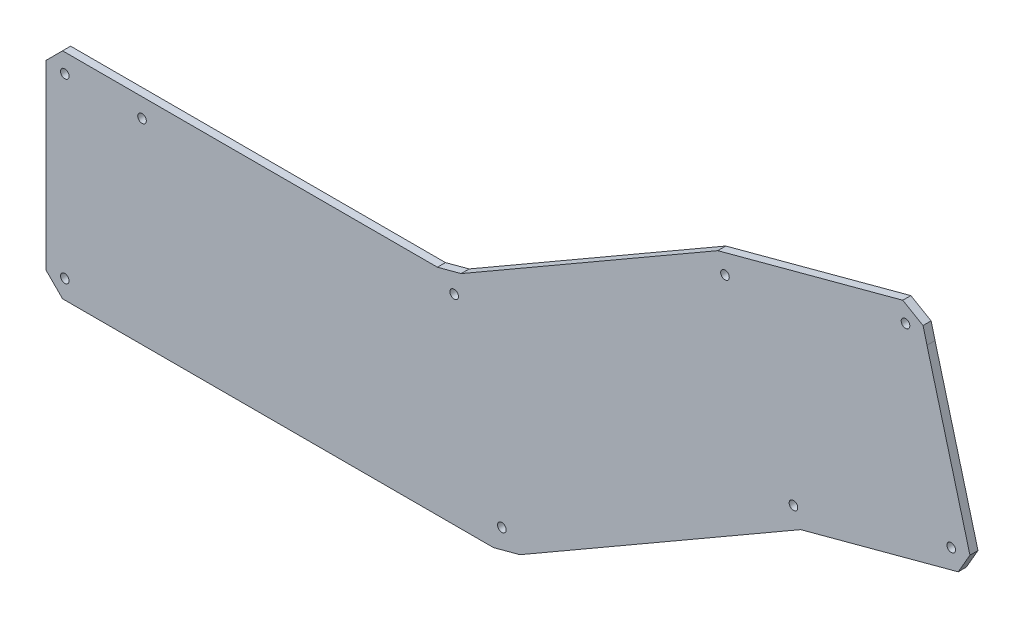
ISO-10303-21;
HEADER;
FILE_DESCRIPTION(('STEP AP214'),'2;1');
FILE_NAME('part.step','',(''),(''),'','','');
FILE_SCHEMA(('AUTOMOTIVE_DESIGN { 1 0 10303 214 1 1 1 1 }'));
ENDSEC;
DATA;
#1=APPLICATION_CONTEXT('core data for automotive mechanical design processes');
#2=APPLICATION_PROTOCOL_DEFINITION('international standard','automotive_design',2000,#1);
#3=PRODUCT_CONTEXT('',#1,'mechanical');
#4=PRODUCT('Part','Part','',(#3));
#5=PRODUCT_RELATED_PRODUCT_CATEGORY('part','',(#4));
#6=PRODUCT_DEFINITION_FORMATION('','',#4);
#7=PRODUCT_DEFINITION_CONTEXT('part definition',#1,'design');
#8=PRODUCT_DEFINITION('design','',#6,#7);
#9=PRODUCT_DEFINITION_SHAPE('','',#8);
#10=(LENGTH_UNIT() NAMED_UNIT(*) SI_UNIT(.MILLI.,.METRE.));
#11=(NAMED_UNIT(*) PLANE_ANGLE_UNIT() SI_UNIT($,.RADIAN.));
#12=(NAMED_UNIT(*) SI_UNIT($,.STERADIAN.) SOLID_ANGLE_UNIT());
#13=UNCERTAINTY_MEASURE_WITH_UNIT(LENGTH_MEASURE(1.E-05),#10,'distance_accuracy_value','');
#14=(GEOMETRIC_REPRESENTATION_CONTEXT(3) GLOBAL_UNCERTAINTY_ASSIGNED_CONTEXT((#13)) GLOBAL_UNIT_ASSIGNED_CONTEXT((#10,
#11,#12)) REPRESENTATION_CONTEXT('',''));
#15=CARTESIAN_POINT('',(0.,0.,0.));
#16=DIRECTION('',(0.,0.,1.));
#17=DIRECTION('',(1.,0.,0.));
#18=AXIS2_PLACEMENT_3D('',#15,#16,#17);
#19=CARTESIAN_POINT('',(0.,0.,3.));
#20=DIRECTION('',(0.,0.,1.));
#21=DIRECTION('',(1.,0.,0.));
#22=AXIS2_PLACEMENT_3D('',#19,#20,#21);
#23=PLANE('',#22);
#24=CARTESIAN_POINT('',(175.63737765536,40.5675958664807,3.));
#25=DIRECTION('',(0.,0.,1.));
#26=DIRECTION('',(1.,0.,0.));
#27=AXIS2_PLACEMENT_3D('',#24,#25,#26);
#28=CIRCLE('',#27,1.59999999999999);
#29=CARTESIAN_POINT('',(177.23737765536,40.5675958664807,3.));
#30=VERTEX_POINT('',#29);
#31=EDGE_CURVE('E619',#30,#30,#28,.T.);
#32=ORIENTED_EDGE('',*,*,#31,.F.);
#33=EDGE_LOOP('',(#32));
#34=FACE_BOUND('',#33,.T.);
#35=CARTESIAN_POINT('',(217.363403759251,120.120565137849,3.));
#36=DIRECTION('',(0.,0.,1.));
#37=DIRECTION('',(1.,0.,0.));
#38=AXIS2_PLACEMENT_3D('',#35,#36,#37);
#39=CIRCLE('',#38,1.60000000000238);
#40=CARTESIAN_POINT('',(218.963403759253,120.120565137849,3.));
#41=VERTEX_POINT('',#40);
#42=EDGE_CURVE('E634',#41,#41,#39,.T.);
#43=ORIENTED_EDGE('',*,*,#42,.F.);
#44=EDGE_LOOP('',(#43));
#45=FACE_BOUND('',#44,.T.);
#46=CARTESIAN_POINT('',(49.2637459726252,45.505477251571,3.));
#47=DIRECTION('',(0.,0.,1.));
#48=DIRECTION('',(1.,0.,0.));
#49=AXIS2_PLACEMENT_3D('',#46,#47,#48);
#50=CIRCLE('',#49,1.6000000000137);
#51=CARTESIAN_POINT('',(50.8637459726389,45.505477251571,3.));
#52=VERTEX_POINT('',#51);
#53=EDGE_CURVE('E648',#52,#52,#50,.T.);
#54=ORIENTED_EDGE('',*,*,#53,.F.);
#55=EDGE_LOOP('',(#54));
#56=FACE_BOUND('',#55,.T.);
#57=CARTESIAN_POINT('',(-66.9886463285399,44.0851063830164,3.));
#58=DIRECTION('',(0.,0.,1.));
#59=DIRECTION('',(1.,0.,0.));
#60=AXIS2_PLACEMENT_3D('',#57,#58,#59);
#61=CIRCLE('',#60,1.60000000001354);
#62=CARTESIAN_POINT('',(-65.3886463285263,44.0851063830164,3.));
#63=VERTEX_POINT('',#62);
#64=EDGE_CURVE('E663',#63,#63,#61,.T.);
#65=ORIENTED_EDGE('',*,*,#64,.F.);
#66=EDGE_LOOP('',(#65));
#67=FACE_BOUND('',#66,.T.);
#68=DIRECTION('',(-1.,0.,0.));
#69=VECTOR('',#68,1.);
#70=CARTESIAN_POINT('',(-75.9886463285399,51.0851063830164,3.));
#71=LINE('',#70,#69);
#72=CARTESIAN_POINT('',(43.0412822424767,51.0851063830164,3.));
#73=VERTEX_POINT('',#72);
#74=CARTESIAN_POINT('',(-96.582189686711,51.0851063830164,3.));
#75=VERTEX_POINT('',#74);
#76=EDGE_CURVE('E58',#73,#75,#71,.T.);
#77=ORIENTED_EDGE('',*,*,#76,.T.);
#78=DIRECTION('',(-0.707106781186548,-0.707106781186547,0.));
#79=VECTOR('',#78,1.);
#80=CARTESIAN_POINT('',(-96.582189686711,51.0851063830164,3.));
#81=LINE('',#80,#79);
#82=CARTESIAN_POINT('',(-102.753762561965,44.9135335077625,3.));
#83=VERTEX_POINT('',#82);
#84=EDGE_CURVE('E286',#75,#83,#81,.T.);
#85=ORIENTED_EDGE('',*,*,#84,.T.);
#86=DIRECTION('',(0.,-1.,0.));
#87=VECTOR('',#86,1.);
#88=CARTESIAN_POINT('',(-102.753762561965,44.9135335077625,3.));
#89=LINE('',#88,#87);
#90=CARTESIAN_POINT('',(-102.753762561965,-22.7433207417298,3.));
#91=VERTEX_POINT('',#90);
#92=EDGE_CURVE('E283',#83,#91,#89,.T.);
#93=ORIENTED_EDGE('',*,*,#92,.T.);
#94=DIRECTION('',(0.707106781186546,-0.707106781186549,0.));
#95=VECTOR('',#94,1.);
#96=CARTESIAN_POINT('',(-102.753762561965,-22.7433207417298,3.));
#97=LINE('',#96,#95);
#98=CARTESIAN_POINT('',(-96.582189686711,-28.9148936169837,3.));
#99=VERTEX_POINT('',#98);
#100=EDGE_CURVE('E307',#91,#99,#97,.T.);
#101=ORIENTED_EDGE('',*,*,#100,.T.);
#102=DIRECTION('',(1.,0.,0.));
#103=VECTOR('',#102,1.);
#104=CARTESIAN_POINT('',(-96.582189686711,-28.9148936169837,3.));
#105=LINE('',#104,#103);
#106=CARTESIAN_POINT('',(63.9320308576805,-28.9148936169837,3.));
#107=VERTEX_POINT('',#106);
#108=EDGE_CURVE('E303',#99,#107,#105,.T.);
#109=ORIENTED_EDGE('',*,*,#108,.T.);
#110=DIRECTION('',(0.965925826289068,0.258819045102521,0.));
#111=VECTOR('',#110,1.);
#112=CARTESIAN_POINT('',(63.9320308576805,-28.9148936169837,3.));
#113=LINE('',#112,#111);
#114=CARTESIAN_POINT('',(73.7708240666632,-26.2785969221399,3.));
#115=VERTEX_POINT('',#114);
#116=EDGE_CURVE('E306',#107,#115,#113,.T.);
#117=ORIENTED_EDGE('',*,*,#116,.T.);
#118=DIRECTION('',(0.866025403784439,0.5,0.));
#119=VECTOR('',#118,1.);
#120=CARTESIAN_POINT('',(178.322766002421,34.084494898768,3.));
#121=LINE('',#120,#119);
#122=CARTESIAN_POINT('',(178.322766002421,34.084494898768,3.));
#123=VERTEX_POINT('',#122);
#124=EDGE_CURVE('E310',#115,#123,#121,.T.);
#125=ORIENTED_EDGE('',*,*,#124,.T.);
#126=DIRECTION('',(0.965925826289064,0.258819045102535,0.));
#127=VECTOR('',#126,1.);
#128=CARTESIAN_POINT('',(178.322766002421,34.084494898768,3.));
#129=LINE('',#128,#127);
#130=CARTESIAN_POINT('',(237.005572371946,49.8085054750752,3.));
#131=VERTEX_POINT('',#130);
#132=EDGE_CURVE('E318',#123,#131,#129,.T.);
#133=ORIENTED_EDGE('',*,*,#132,.T.);
#134=DIRECTION('',(0.5,0.866025403784439,0.));
#135=VECTOR('',#134,1.);
#136=CARTESIAN_POINT('',(237.005572371946,49.8085054750752,3.));
#137=LINE('',#136,#135);
#138=CARTESIAN_POINT('',(241.369533402625,57.3671077024617,3.));
#139=VERTEX_POINT('',#138);
#140=EDGE_CURVE('E321',#131,#139,#137,.T.);
#141=ORIENTED_EDGE('',*,*,#140,.T.);
#142=DIRECTION('',(-0.258819045102535,0.965925826289065,0.));
#143=VECTOR('',#142,1.);
#144=CARTESIAN_POINT('',(230.025901745853,99.7021173878823,3.));
#145=LINE('',#144,#143);
#146=CARTESIAN_POINT('',(225.368652660977,117.08320759614,3.));
#147=VERTEX_POINT('',#146);
#148=EDGE_CURVE('E324',#139,#147,#145,.T.);
#149=ORIENTED_EDGE('',*,*,#148,.T.);
#150=DIRECTION('',(-0.253240116178307,0.967403454386016,0.));
#151=VECTOR('',#150,1.);
#152=CARTESIAN_POINT('',(223.893223798705,122.719498558263,3.));
#153=LINE('',#152,#151);
#154=CARTESIAN_POINT('',(223.893223798705,122.719498558263,3.));
#155=VERTEX_POINT('',#154);
#156=EDGE_CURVE('E327',#147,#155,#153,.T.);
#157=ORIENTED_EDGE('',*,*,#156,.T.);
#158=DIRECTION('',(-0.864578974635098,0.502496961800689,0.));
#159=VECTOR('',#158,1.);
#160=CARTESIAN_POINT('',(216.359063387013,127.098384498893,3.));
#161=LINE('',#160,#159);
#162=CARTESIAN_POINT('',(216.359063387013,127.098384498893,3.));
#163=VERTEX_POINT('',#162);
#164=EDGE_CURVE('E174',#155,#163,#161,.T.);
#165=ORIENTED_EDGE('',*,*,#164,.T.);
#166=DIRECTION('',(-0.965925826289065,-0.258819045102534,0.));
#167=VECTOR('',#166,1.);
#168=CARTESIAN_POINT('',(210.670220477297,125.574063635367,3.));
#169=LINE('',#168,#167);
#170=CARTESIAN_POINT('',(147.443918592992,108.63262710506,3.));
#171=VERTEX_POINT('',#170);
#172=EDGE_CURVE('E168',#163,#171,#169,.T.);
#173=ORIENTED_EDGE('',*,*,#172,.T.);
#174=DIRECTION('',(-0.866025403784439,-0.5,0.));
#175=VECTOR('',#174,1.);
#176=CARTESIAN_POINT('',(147.443918592992,108.63262710506,3.));
#177=LINE('',#176,#175);
#178=CARTESIAN_POINT('',(51.8627430713385,53.4488096881727,3.));
#179=VERTEX_POINT('',#178);
#180=EDGE_CURVE('E172',#171,#179,#177,.T.);
#181=ORIENTED_EDGE('',*,*,#180,.T.);
#182=DIRECTION('',(-0.965925826289068,-0.258819045102522,0.));
#183=VECTOR('',#182,1.);
#184=CARTESIAN_POINT('',(51.8627430713385,53.4488096881727,3.));
#185=LINE('',#184,#183);
#186=EDGE_CURVE('E190',#179,#73,#185,.T.);
#187=ORIENTED_EDGE('',*,*,#186,.T.);
#188=EDGE_LOOP('',(#77,#85,#93,#101,#109,#117,#125,#133,#141,#149,#157,#165,#173,#181,#187));
#189=FACE_BOUND('',#188,.T.);
#190=CARTESIAN_POINT('',(-95.7537625619648,44.0851063830164,3.));
#191=DIRECTION('',(0.,0.,1.));
#192=DIRECTION('',(1.,0.,0.));
#193=AXIS2_PLACEMENT_3D('',#190,#191,#192);
#194=CIRCLE('',#193,1.59999999999237);
#195=CARTESIAN_POINT('',(-94.1537625619724,44.0851063830164,3.));
#196=VERTEX_POINT('',#195);
#197=EDGE_CURVE('E202',#196,#196,#194,.T.);
#198=ORIENTED_EDGE('',*,*,#197,.F.);
#199=EDGE_LOOP('',(#198));
#200=FACE_BOUND('',#199,.T.);
#201=CARTESIAN_POINT('',(-95.7537625619648,-21.9148936169837,3.));
#202=DIRECTION('',(0.,0.,1.));
#203=DIRECTION('',(1.,0.,0.));
#204=AXIS2_PLACEMENT_3D('',#201,#202,#203);
#205=CIRCLE('',#204,1.59999999999239);
#206=CARTESIAN_POINT('',(-94.1537625619724,-21.9148936169837,3.));
#207=VERTEX_POINT('',#206);
#208=EDGE_CURVE('E656',#207,#207,#205,.T.);
#209=ORIENTED_EDGE('',*,*,#208,.F.);
#210=EDGE_LOOP('',(#209));
#211=FACE_BOUND('',#210,.T.);
#212=CARTESIAN_POINT('',(67.0396941464542,-20.8352644855383,3.));
#213=DIRECTION('',(0.,0.,1.));
#214=DIRECTION('',(1.,0.,0.));
#215=AXIS2_PLACEMENT_3D('',#212,#213,#214);
#216=CIRCLE('',#215,1.59999999992845);
#217=CARTESIAN_POINT('',(68.6396941463826,-20.8352644855383,3.));
#218=VERTEX_POINT('',#217);
#219=EDGE_CURVE('E640',#218,#218,#216,.T.);
#220=ORIENTED_EDGE('',*,*,#219,.F.);
#221=EDGE_LOOP('',(#220));
#222=FACE_BOUND('',#221,.T.);
#223=CARTESIAN_POINT('',(150.129306940052,102.149526137347,3.));
#224=DIRECTION('',(0.,0.,1.));
#225=DIRECTION('',(1.,0.,0.));
#226=AXIS2_PLACEMENT_3D('',#223,#224,#225);
#227=CIRCLE('',#226,1.60000000000809);
#228=CARTESIAN_POINT('',(151.729306940061,102.149526137347,3.));
#229=VERTEX_POINT('',#228);
#230=EDGE_CURVE('E627',#229,#229,#227,.T.);
#231=ORIENTED_EDGE('',*,*,#230,.F.);
#232=EDGE_LOOP('',(#231));
#233=FACE_BOUND('',#232,.T.);
#234=CARTESIAN_POINT('',(234.393639901238,56.3555735417348,3.));
#235=DIRECTION('',(0.,0.,1.));
#236=DIRECTION('',(1.,0.,0.));
#237=AXIS2_PLACEMENT_3D('',#234,#235,#236);
#238=CIRCLE('',#237,1.59999999999999);
#239=CARTESIAN_POINT('',(235.993639901238,56.3555735417348,3.));
#240=VERTEX_POINT('',#239);
#241=EDGE_CURVE('E608',#240,#240,#238,.T.);
#242=ORIENTED_EDGE('',*,*,#241,.F.);
#243=EDGE_LOOP('',(#242));
#244=FACE_BOUND('',#243,.T.);
#245=ADVANCED_FACE('F38',(#34,#45,#56,#67,#189,#200,#211,#222,#233,#244),#23,.T.);
#246=CARTESIAN_POINT('',(0.,0.,0.));
#247=DIRECTION('',(0.,0.,1.));
#248=DIRECTION('',(1.,0.,0.));
#249=AXIS2_PLACEMENT_3D('',#246,#247,#248);
#250=PLANE('',#249);
#251=DIRECTION('',(-0.707106781186548,-0.707106781186547,0.));
#252=VECTOR('',#251,1.);
#253=CARTESIAN_POINT('',(-96.582189686711,51.0851063830164,0.));
#254=LINE('',#253,#252);
#255=CARTESIAN_POINT('',(-96.582189686711,51.0851063830164,0.));
#256=VERTEX_POINT('',#255);
#257=CARTESIAN_POINT('',(-102.753762561965,44.9135335077625,0.));
#258=VERTEX_POINT('',#257);
#259=EDGE_CURVE('E198',#256,#258,#254,.T.);
#260=ORIENTED_EDGE('',*,*,#259,.F.);
#261=DIRECTION('',(-1.,0.,0.));
#262=VECTOR('',#261,1.);
#263=CARTESIAN_POINT('',(-75.9886463285399,51.0851063830164,0.));
#264=LINE('',#263,#262);
#265=CARTESIAN_POINT('',(43.0412822424767,51.0851063830164,0.));
#266=VERTEX_POINT('',#265);
#267=EDGE_CURVE('E237',#266,#256,#264,.T.);
#268=ORIENTED_EDGE('',*,*,#267,.F.);
#269=DIRECTION('',(-0.965925826289068,-0.258819045102522,0.));
#270=VECTOR('',#269,1.);
#271=CARTESIAN_POINT('',(51.8627430713385,53.4488096881727,0.));
#272=LINE('',#271,#270);
#273=CARTESIAN_POINT('',(51.8627430713385,53.4488096881727,0.));
#274=VERTEX_POINT('',#273);
#275=EDGE_CURVE('E124',#274,#266,#272,.T.);
#276=ORIENTED_EDGE('',*,*,#275,.F.);
#277=DIRECTION('',(-0.866025403784439,-0.5,0.));
#278=VECTOR('',#277,1.);
#279=CARTESIAN_POINT('',(147.443918592992,108.63262710506,0.));
#280=LINE('',#279,#278);
#281=CARTESIAN_POINT('',(147.443918592992,108.63262710506,0.));
#282=VERTEX_POINT('',#281);
#283=EDGE_CURVE('E117',#282,#274,#280,.T.);
#284=ORIENTED_EDGE('',*,*,#283,.F.);
#285=DIRECTION('',(-0.965925826289065,-0.258819045102535,0.));
#286=VECTOR('',#285,1.);
#287=CARTESIAN_POINT('',(147.443918592992,108.63262710506,0.));
#288=LINE('',#287,#286);
#289=CARTESIAN_POINT('',(216.359063387013,127.098384498893,0.));
#290=VERTEX_POINT('',#289);
#291=EDGE_CURVE('E182',#290,#282,#288,.T.);
#292=ORIENTED_EDGE('',*,*,#291,.F.);
#293=DIRECTION('',(-0.864578974635098,0.502496961800689,0.));
#294=VECTOR('',#293,1.);
#295=CARTESIAN_POINT('',(216.359063387013,127.098384498893,0.));
#296=LINE('',#295,#294);
#297=CARTESIAN_POINT('',(223.893223798705,122.719498558263,0.));
#298=VERTEX_POINT('',#297);
#299=EDGE_CURVE('E228',#298,#290,#296,.T.);
#300=ORIENTED_EDGE('',*,*,#299,.F.);
#301=DIRECTION('',(-0.253240116178307,0.967403454386016,0.));
#302=VECTOR('',#301,1.);
#303=CARTESIAN_POINT('',(223.893223798705,122.719498558263,0.));
#304=LINE('',#303,#302);
#305=CARTESIAN_POINT('',(225.368652660977,117.08320759614,0.));
#306=VERTEX_POINT('',#305);
#307=EDGE_CURVE('E226',#306,#298,#304,.T.);
#308=ORIENTED_EDGE('',*,*,#307,.F.);
#309=DIRECTION('',(-0.258819045102519,0.965925826289069,0.));
#310=VECTOR('',#309,1.);
#311=CARTESIAN_POINT('',(225.368652660977,117.08320759614,0.));
#312=LINE('',#311,#310);
#313=CARTESIAN_POINT('',(241.369533402625,57.3671077024617,0.));
#314=VERTEX_POINT('',#313);
#315=EDGE_CURVE('E223',#314,#306,#312,.T.);
#316=ORIENTED_EDGE('',*,*,#315,.F.);
#317=DIRECTION('',(0.5,0.866025403784439,0.));
#318=VECTOR('',#317,1.);
#319=CARTESIAN_POINT('',(237.005572371946,49.8085054750752,0.));
#320=LINE('',#319,#318);
#321=CARTESIAN_POINT('',(237.005572371946,49.8085054750752,0.));
#322=VERTEX_POINT('',#321);
#323=EDGE_CURVE('E219',#322,#314,#320,.T.);
#324=ORIENTED_EDGE('',*,*,#323,.F.);
#325=DIRECTION('',(0.965925826289064,0.258819045102535,0.));
#326=VECTOR('',#325,1.);
#327=CARTESIAN_POINT('',(178.322766002421,34.084494898768,0.));
#328=LINE('',#327,#326);
#329=CARTESIAN_POINT('',(178.322766002421,34.084494898768,0.));
#330=VERTEX_POINT('',#329);
#331=EDGE_CURVE('E216',#330,#322,#328,.T.);
#332=ORIENTED_EDGE('',*,*,#331,.F.);
#333=DIRECTION('',(0.866025403784439,0.5,0.));
#334=VECTOR('',#333,1.);
#335=CARTESIAN_POINT('',(178.322766002421,34.084494898768,0.));
#336=LINE('',#335,#334);
#337=CARTESIAN_POINT('',(73.7708240666632,-26.2785969221399,0.));
#338=VERTEX_POINT('',#337);
#339=EDGE_CURVE('E213',#338,#330,#336,.T.);
#340=ORIENTED_EDGE('',*,*,#339,.F.);
#341=DIRECTION('',(0.965925826289068,0.258819045102521,0.));
#342=VECTOR('',#341,1.);
#343=CARTESIAN_POINT('',(63.9320308576805,-28.9148936169837,0.));
#344=LINE('',#343,#342);
#345=CARTESIAN_POINT('',(63.9320308576805,-28.9148936169837,0.));
#346=VERTEX_POINT('',#345);
#347=EDGE_CURVE('E210',#346,#338,#344,.T.);
#348=ORIENTED_EDGE('',*,*,#347,.F.);
#349=DIRECTION('',(1.,0.,0.));
#350=VECTOR('',#349,1.);
#351=CARTESIAN_POINT('',(-96.582189686711,-28.9148936169837,0.));
#352=LINE('',#351,#350);
#353=CARTESIAN_POINT('',(-96.582189686711,-28.9148936169837,0.));
#354=VERTEX_POINT('',#353);
#355=EDGE_CURVE('E207',#354,#346,#352,.T.);
#356=ORIENTED_EDGE('',*,*,#355,.F.);
#357=DIRECTION('',(0.707106781186546,-0.707106781186549,0.));
#358=VECTOR('',#357,1.);
#359=CARTESIAN_POINT('',(-102.753762561965,-22.7433207417298,0.));
#360=LINE('',#359,#358);
#361=CARTESIAN_POINT('',(-102.753762561965,-22.7433207417298,0.));
#362=VERTEX_POINT('',#361);
#363=EDGE_CURVE('E204',#362,#354,#360,.T.);
#364=ORIENTED_EDGE('',*,*,#363,.F.);
#365=DIRECTION('',(0.,-1.,0.));
#366=VECTOR('',#365,1.);
#367=CARTESIAN_POINT('',(-102.753762561965,35.7952277199684,0.));
#368=LINE('',#367,#366);
#369=EDGE_CURVE('E201',#258,#362,#368,.T.);
#370=ORIENTED_EDGE('',*,*,#369,.F.);
#371=EDGE_LOOP('',(#260,#268,#276,#284,#292,#300,#308,#316,#324,#332,#340,#348,#356,#364,#370));
#372=FACE_BOUND('',#371,.T.);
#373=CARTESIAN_POINT('',(-95.7537625619648,44.0851063830164,0.));
#374=DIRECTION('',(0.,0.,1.));
#375=DIRECTION('',(1.,0.,0.));
#376=AXIS2_PLACEMENT_3D('',#373,#374,#375);
#377=CIRCLE('',#376,1.59999999999237);
#378=CARTESIAN_POINT('',(-94.1537625619724,44.0851063830164,0.));
#379=VERTEX_POINT('',#378);
#380=EDGE_CURVE('E666',#379,#379,#377,.T.);
#381=ORIENTED_EDGE('',*,*,#380,.T.);
#382=EDGE_LOOP('',(#381));
#383=FACE_BOUND('',#382,.T.);
#384=CARTESIAN_POINT('',(-66.9886463285399,44.0851063830164,0.));
#385=DIRECTION('',(0.,0.,1.));
#386=DIRECTION('',(1.,0.,0.));
#387=AXIS2_PLACEMENT_3D('',#384,#385,#386);
#388=CIRCLE('',#387,1.60000000001354);
#389=CARTESIAN_POINT('',(-65.3886463285263,44.0851063830164,0.));
#390=VERTEX_POINT('',#389);
#391=EDGE_CURVE('E660',#390,#390,#388,.T.);
#392=ORIENTED_EDGE('',*,*,#391,.T.);
#393=EDGE_LOOP('',(#392));
#394=FACE_BOUND('',#393,.T.);
#395=CARTESIAN_POINT('',(-95.7537625619648,-21.9148936169837,0.));
#396=DIRECTION('',(0.,0.,1.));
#397=DIRECTION('',(1.,0.,0.));
#398=AXIS2_PLACEMENT_3D('',#395,#396,#397);
#399=CIRCLE('',#398,1.59999999999239);
#400=CARTESIAN_POINT('',(-94.1537625619724,-21.9148936169837,0.));
#401=VERTEX_POINT('',#400);
#402=EDGE_CURVE('E652',#401,#401,#399,.T.);
#403=ORIENTED_EDGE('',*,*,#402,.T.);
#404=EDGE_LOOP('',(#403));
#405=FACE_BOUND('',#404,.T.);
#406=CARTESIAN_POINT('',(49.2637459726252,45.505477251571,0.));
#407=DIRECTION('',(0.,0.,1.));
#408=DIRECTION('',(1.,0.,0.));
#409=AXIS2_PLACEMENT_3D('',#406,#407,#408);
#410=CIRCLE('',#409,1.6000000000137);
#411=CARTESIAN_POINT('',(50.8637459726389,45.505477251571,0.));
#412=VERTEX_POINT('',#411);
#413=EDGE_CURVE('E644',#412,#412,#410,.T.);
#414=ORIENTED_EDGE('',*,*,#413,.T.);
#415=EDGE_LOOP('',(#414));
#416=FACE_BOUND('',#415,.T.);
#417=CARTESIAN_POINT('',(67.0396941464542,-20.8352644855383,0.));
#418=DIRECTION('',(0.,0.,1.));
#419=DIRECTION('',(1.,0.,0.));
#420=AXIS2_PLACEMENT_3D('',#417,#418,#419);
#421=CIRCLE('',#420,1.59999999992845);
#422=CARTESIAN_POINT('',(68.6396941463826,-20.8352644855383,0.));
#423=VERTEX_POINT('',#422);
#424=EDGE_CURVE('E637',#423,#423,#421,.T.);
#425=ORIENTED_EDGE('',*,*,#424,.T.);
#426=EDGE_LOOP('',(#425));
#427=FACE_BOUND('',#426,.T.);
#428=CARTESIAN_POINT('',(217.363403759251,120.120565137849,0.));
#429=DIRECTION('',(0.,0.,1.));
#430=DIRECTION('',(1.,0.,0.));
#431=AXIS2_PLACEMENT_3D('',#428,#429,#430);
#432=CIRCLE('',#431,1.60000000000238);
#433=CARTESIAN_POINT('',(218.963403759253,120.120565137849,0.));
#434=VERTEX_POINT('',#433);
#435=EDGE_CURVE('E630',#434,#434,#432,.T.);
#436=ORIENTED_EDGE('',*,*,#435,.T.);
#437=EDGE_LOOP('',(#436));
#438=FACE_BOUND('',#437,.T.);
#439=CARTESIAN_POINT('',(150.129306940052,102.149526137347,0.));
#440=DIRECTION('',(0.,0.,1.));
#441=DIRECTION('',(1.,0.,0.));
#442=AXIS2_PLACEMENT_3D('',#439,#440,#441);
#443=CIRCLE('',#442,1.60000000000809);
#444=CARTESIAN_POINT('',(151.729306940061,102.149526137347,0.));
#445=VERTEX_POINT('',#444);
#446=EDGE_CURVE('E623',#445,#445,#443,.T.);
#447=ORIENTED_EDGE('',*,*,#446,.T.);
#448=EDGE_LOOP('',(#447));
#449=FACE_BOUND('',#448,.T.);
#450=CARTESIAN_POINT('',(175.63737765536,40.5675958664807,0.));
#451=DIRECTION('',(0.,0.,1.));
#452=DIRECTION('',(1.,0.,0.));
#453=AXIS2_PLACEMENT_3D('',#450,#451,#452);
#454=CIRCLE('',#453,1.59999999999999);
#455=CARTESIAN_POINT('',(177.23737765536,40.5675958664807,0.));
#456=VERTEX_POINT('',#455);
#457=EDGE_CURVE('E616',#456,#456,#454,.T.);
#458=ORIENTED_EDGE('',*,*,#457,.T.);
#459=EDGE_LOOP('',(#458));
#460=FACE_BOUND('',#459,.T.);
#461=CARTESIAN_POINT('',(234.393639901238,56.3555735417348,0.));
#462=DIRECTION('',(0.,0.,1.));
#463=DIRECTION('',(1.,0.,0.));
#464=AXIS2_PLACEMENT_3D('',#461,#462,#463);
#465=CIRCLE('',#464,1.59999999999999);
#466=CARTESIAN_POINT('',(235.993639901238,56.3555735417348,0.));
#467=VERTEX_POINT('',#466);
#468=EDGE_CURVE('E611',#467,#467,#465,.T.);
#469=ORIENTED_EDGE('',*,*,#468,.T.);
#470=EDGE_LOOP('',(#469));
#471=FACE_BOUND('',#470,.T.);
#472=ADVANCED_FACE('F290',(#372,#383,#394,#405,#416,#427,#438,#449,#460,#471),#250,.F.);
#473=CARTESIAN_POINT('',(-96.582189686711,51.0851063830164,3.));
#474=DIRECTION('',(0.707106781186547,-0.707106781186548,0.));
#475=DIRECTION('',(0.707106781186548,0.707106781186547,0.));
#476=AXIS2_PLACEMENT_3D('',#473,#474,#475);
#477=PLANE('',#476);
#478=ORIENTED_EDGE('',*,*,#259,.T.);
#479=DIRECTION('',(0.,0.,-1.));
#480=VECTOR('',#479,1.);
#481=CARTESIAN_POINT('',(-102.753762561965,44.9135335077625,3.));
#482=LINE('',#481,#480);
#483=EDGE_CURVE('E47',#83,#258,#482,.T.);
#484=ORIENTED_EDGE('',*,*,#483,.F.);
#485=ORIENTED_EDGE('',*,*,#84,.F.);
#486=DIRECTION('',(0.,0.,-1.));
#487=VECTOR('',#486,1.);
#488=CARTESIAN_POINT('',(-96.582189686711,51.0851063830164,3.));
#489=LINE('',#488,#487);
#490=EDGE_CURVE('E11',#75,#256,#489,.T.);
#491=ORIENTED_EDGE('',*,*,#490,.T.);
#492=EDGE_LOOP('',(#478,#484,#485,#491));
#493=FACE_BOUND('',#492,.T.);
#494=ADVANCED_FACE('F40',(#493),#477,.F.);
#495=CARTESIAN_POINT('',(-102.753762561965,35.7952277199684,3.));
#496=DIRECTION('',(1.,0.,0.));
#497=DIRECTION('',(0.,1.,0.));
#498=AXIS2_PLACEMENT_3D('',#495,#496,#497);
#499=PLANE('',#498);
#500=ORIENTED_EDGE('',*,*,#369,.T.);
#501=DIRECTION('',(0.,0.,-1.));
#502=VECTOR('',#501,1.);
#503=CARTESIAN_POINT('',(-102.753762561965,-22.7433207417298,3.));
#504=LINE('',#503,#502);
#505=EDGE_CURVE('E274',#91,#362,#504,.T.);
#506=ORIENTED_EDGE('',*,*,#505,.F.);
#507=ORIENTED_EDGE('',*,*,#92,.F.);
#508=ORIENTED_EDGE('',*,*,#483,.T.);
#509=EDGE_LOOP('',(#500,#506,#507,#508));
#510=FACE_BOUND('',#509,.T.);
#511=ADVANCED_FACE('F281',(#510),#499,.F.);
#512=CARTESIAN_POINT('',(-102.753762561965,-22.7433207417298,3.));
#513=DIRECTION('',(0.707106781186549,0.707106781186546,0.));
#514=DIRECTION('',(-0.707106781186546,0.707106781186549,0.));
#515=AXIS2_PLACEMENT_3D('',#512,#513,#514);
#516=PLANE('',#515);
#517=ORIENTED_EDGE('',*,*,#363,.T.);
#518=DIRECTION('',(0.,0.,-1.));
#519=VECTOR('',#518,1.);
#520=CARTESIAN_POINT('',(-96.582189686711,-28.9148936169837,3.));
#521=LINE('',#520,#519);
#522=EDGE_CURVE('E270',#99,#354,#521,.T.);
#523=ORIENTED_EDGE('',*,*,#522,.F.);
#524=ORIENTED_EDGE('',*,*,#100,.F.);
#525=ORIENTED_EDGE('',*,*,#505,.T.);
#526=EDGE_LOOP('',(#517,#523,#524,#525));
#527=FACE_BOUND('',#526,.T.);
#528=ADVANCED_FACE('F297',(#527),#516,.F.);
#529=CARTESIAN_POINT('',(-96.582189686711,-28.9148936169837,3.));
#530=DIRECTION('',(0.,1.,0.));
#531=DIRECTION('',(0.,0.,1.));
#532=AXIS2_PLACEMENT_3D('',#529,#530,#531);
#533=PLANE('',#532);
#534=ORIENTED_EDGE('',*,*,#355,.T.);
#535=DIRECTION('',(0.,0.,-1.));
#536=VECTOR('',#535,1.);
#537=CARTESIAN_POINT('',(63.9320308576805,-28.9148936169837,3.));
#538=LINE('',#537,#536);
#539=EDGE_CURVE('E266',#107,#346,#538,.T.);
#540=ORIENTED_EDGE('',*,*,#539,.F.);
#541=ORIENTED_EDGE('',*,*,#108,.F.);
#542=ORIENTED_EDGE('',*,*,#522,.T.);
#543=EDGE_LOOP('',(#534,#540,#541,#542));
#544=FACE_BOUND('',#543,.T.);
#545=ADVANCED_FACE('F301',(#544),#533,.F.);
#546=CARTESIAN_POINT('',(63.9320308576805,-28.9148936169837,3.));
#547=DIRECTION('',(-0.258819045102521,0.965925826289068,0.));
#548=DIRECTION('',(-0.965925826289068,-0.258819045102521,0.));
#549=AXIS2_PLACEMENT_3D('',#546,#547,#548);
#550=PLANE('',#549);
#551=ORIENTED_EDGE('',*,*,#347,.T.);
#552=DIRECTION('',(0.,0.,-1.));
#553=VECTOR('',#552,1.);
#554=CARTESIAN_POINT('',(73.7708240666632,-26.2785969221399,3.));
#555=LINE('',#554,#553);
#556=EDGE_CURVE('E262',#115,#338,#555,.T.);
#557=ORIENTED_EDGE('',*,*,#556,.F.);
#558=ORIENTED_EDGE('',*,*,#116,.F.);
#559=ORIENTED_EDGE('',*,*,#539,.T.);
#560=EDGE_LOOP('',(#551,#557,#558,#559));
#561=FACE_BOUND('',#560,.T.);
#562=ADVANCED_FACE('F542',(#561),#550,.F.);
#563=CARTESIAN_POINT('',(178.322766002421,34.084494898768,3.));
#564=DIRECTION('',(-0.5,0.866025403784439,0.));
#565=DIRECTION('',(-0.866025403784439,-0.5,0.));
#566=AXIS2_PLACEMENT_3D('',#563,#564,#565);
#567=PLANE('',#566);
#568=ORIENTED_EDGE('',*,*,#339,.T.);
#569=DIRECTION('',(0.,0.,-1.));
#570=VECTOR('',#569,1.);
#571=CARTESIAN_POINT('',(178.322766002421,34.084494898768,3.));
#572=LINE('',#571,#570);
#573=EDGE_CURVE('E258',#123,#330,#572,.T.);
#574=ORIENTED_EDGE('',*,*,#573,.F.);
#575=ORIENTED_EDGE('',*,*,#124,.F.);
#576=ORIENTED_EDGE('',*,*,#556,.T.);
#577=EDGE_LOOP('',(#568,#574,#575,#576));
#578=FACE_BOUND('',#577,.T.);
#579=ADVANCED_FACE('F532',(#578),#567,.F.);
#580=CARTESIAN_POINT('',(178.322766002421,34.084494898768,3.));
#581=DIRECTION('',(-0.258819045102535,0.965925826289064,0.));
#582=DIRECTION('',(-0.965925826289064,-0.258819045102535,0.));
#583=AXIS2_PLACEMENT_3D('',#580,#581,#582);
#584=PLANE('',#583);
#585=ORIENTED_EDGE('',*,*,#331,.T.);
#586=DIRECTION('',(0.,0.,-1.));
#587=VECTOR('',#586,1.);
#588=CARTESIAN_POINT('',(237.005572371946,49.8085054750752,3.));
#589=LINE('',#588,#587);
#590=EDGE_CURVE('E255',#131,#322,#589,.T.);
#591=ORIENTED_EDGE('',*,*,#590,.F.);
#592=ORIENTED_EDGE('',*,*,#132,.F.);
#593=ORIENTED_EDGE('',*,*,#573,.T.);
#594=EDGE_LOOP('',(#585,#591,#592,#593));
#595=FACE_BOUND('',#594,.T.);
#596=ADVANCED_FACE('F354',(#595),#584,.F.);
#597=CARTESIAN_POINT('',(237.005572371946,49.8085054750752,3.));
#598=DIRECTION('',(-0.866025403784439,0.5,0.));
#599=DIRECTION('',(-0.5,-0.866025403784439,0.));
#600=AXIS2_PLACEMENT_3D('',#597,#598,#599);
#601=PLANE('',#600);
#602=ORIENTED_EDGE('',*,*,#323,.T.);
#603=DIRECTION('',(0.,0.,-1.));
#604=VECTOR('',#603,1.);
#605=CARTESIAN_POINT('',(241.369533402625,57.3671077024617,3.));
#606=LINE('',#605,#604);
#607=EDGE_CURVE('E251',#139,#314,#606,.T.);
#608=ORIENTED_EDGE('',*,*,#607,.F.);
#609=ORIENTED_EDGE('',*,*,#140,.F.);
#610=ORIENTED_EDGE('',*,*,#590,.T.);
#611=EDGE_LOOP('',(#602,#608,#609,#610));
#612=FACE_BOUND('',#611,.T.);
#613=ADVANCED_FACE('F343',(#612),#601,.F.);
#614=CARTESIAN_POINT('',(225.368652660977,117.08320759614,3.));
#615=DIRECTION('',(-0.965925826289069,-0.258819045102519,0.));
#616=DIRECTION('',(0.258819045102519,-0.965925826289069,0.));
#617=AXIS2_PLACEMENT_3D('',#614,#615,#616);
#618=PLANE('',#617);
#619=ORIENTED_EDGE('',*,*,#315,.T.);
#620=DIRECTION('',(0.,0.,-1.));
#621=VECTOR('',#620,1.);
#622=CARTESIAN_POINT('',(225.368652660977,117.08320759614,3.));
#623=LINE('',#622,#621);
#624=EDGE_CURVE('E248',#147,#306,#623,.T.);
#625=ORIENTED_EDGE('',*,*,#624,.F.);
#626=ORIENTED_EDGE('',*,*,#148,.F.);
#627=ORIENTED_EDGE('',*,*,#607,.T.);
#628=EDGE_LOOP('',(#619,#625,#626,#627));
#629=FACE_BOUND('',#628,.T.);
#630=ADVANCED_FACE('F346',(#629),#618,.F.);
#631=CARTESIAN_POINT('',(223.893223798705,122.719498558263,3.));
#632=DIRECTION('',(-0.967403454386017,-0.253240116178307,0.));
#633=DIRECTION('',(0.253240116178307,-0.967403454386017,0.));
#634=AXIS2_PLACEMENT_3D('',#631,#632,#633);
#635=PLANE('',#634);
#636=ORIENTED_EDGE('',*,*,#307,.T.);
#637=DIRECTION('',(0.,0.,-1.));
#638=VECTOR('',#637,1.);
#639=CARTESIAN_POINT('',(223.893223798705,122.719498558263,3.));
#640=LINE('',#639,#638);
#641=EDGE_CURVE('E245',#155,#298,#640,.T.);
#642=ORIENTED_EDGE('',*,*,#641,.F.);
#643=ORIENTED_EDGE('',*,*,#156,.F.);
#644=ORIENTED_EDGE('',*,*,#624,.T.);
#645=EDGE_LOOP('',(#636,#642,#643,#644));
#646=FACE_BOUND('',#645,.T.);
#647=ADVANCED_FACE('F333',(#646),#635,.F.);
#648=CARTESIAN_POINT('',(216.359063387013,127.098384498893,3.));
#649=DIRECTION('',(-0.502496961800689,-0.864578974635097,0.));
#650=DIRECTION('',(0.864578974635098,-0.502496961800689,0.));
#651=AXIS2_PLACEMENT_3D('',#648,#649,#650);
#652=PLANE('',#651);
#653=ORIENTED_EDGE('',*,*,#299,.T.);
#654=DIRECTION('',(0.,0.,-1.));
#655=VECTOR('',#654,1.);
#656=CARTESIAN_POINT('',(216.359063387013,127.098384498893,3.));
#657=LINE('',#656,#655);
#658=EDGE_CURVE('E184',#163,#290,#657,.T.);
#659=ORIENTED_EDGE('',*,*,#658,.F.);
#660=ORIENTED_EDGE('',*,*,#164,.F.);
#661=ORIENTED_EDGE('',*,*,#641,.T.);
#662=EDGE_LOOP('',(#653,#659,#660,#661));
#663=FACE_BOUND('',#662,.T.);
#664=ADVANCED_FACE('F337',(#663),#652,.F.);
#665=CARTESIAN_POINT('',(147.443918592992,108.63262710506,3.));
#666=DIRECTION('',(0.258819045102535,-0.965925826289064,0.));
#667=DIRECTION('',(0.965925826289065,0.258819045102535,0.));
#668=AXIS2_PLACEMENT_3D('',#665,#666,#667);
#669=PLANE('',#668);
#670=ORIENTED_EDGE('',*,*,#291,.T.);
#671=DIRECTION('',(0.,0.,-1.));
#672=VECTOR('',#671,1.);
#673=CARTESIAN_POINT('',(147.443918592992,108.63262710506,3.));
#674=LINE('',#673,#672);
#675=EDGE_CURVE('E180',#171,#282,#674,.T.);
#676=ORIENTED_EDGE('',*,*,#675,.F.);
#677=ORIENTED_EDGE('',*,*,#172,.F.);
#678=ORIENTED_EDGE('',*,*,#658,.T.);
#679=EDGE_LOOP('',(#670,#676,#677,#678));
#680=FACE_BOUND('',#679,.T.);
#681=ADVANCED_FACE('F181',(#680),#669,.F.);
#682=CARTESIAN_POINT('',(147.443918592992,108.63262710506,3.));
#683=DIRECTION('',(0.5,-0.866025403784438,0.));
#684=DIRECTION('',(0.866025403784439,0.5,0.));
#685=AXIS2_PLACEMENT_3D('',#682,#683,#684);
#686=PLANE('',#685);
#687=ORIENTED_EDGE('',*,*,#283,.T.);
#688=DIRECTION('',(0.,0.,-1.));
#689=VECTOR('',#688,1.);
#690=CARTESIAN_POINT('',(51.8627430713385,53.4488096881727,3.));
#691=LINE('',#690,#689);
#692=EDGE_CURVE('E185',#179,#274,#691,.T.);
#693=ORIENTED_EDGE('',*,*,#692,.F.);
#694=ORIENTED_EDGE('',*,*,#180,.F.);
#695=ORIENTED_EDGE('',*,*,#675,.T.);
#696=EDGE_LOOP('',(#687,#693,#694,#695));
#697=FACE_BOUND('',#696,.T.);
#698=ADVANCED_FACE('F187',(#697),#686,.F.);
#699=CARTESIAN_POINT('',(51.8627430713385,53.4488096881727,3.));
#700=DIRECTION('',(0.258819045102522,-0.965925826289068,0.));
#701=DIRECTION('',(0.965925826289068,0.258819045102522,0.));
#702=AXIS2_PLACEMENT_3D('',#699,#700,#701);
#703=PLANE('',#702);
#704=ORIENTED_EDGE('',*,*,#275,.T.);
#705=DIRECTION('',(0.,0.,-1.));
#706=VECTOR('',#705,1.);
#707=CARTESIAN_POINT('',(43.0412822424767,51.0851063830164,3.));
#708=LINE('',#707,#706);
#709=EDGE_CURVE('E194',#73,#266,#708,.T.);
#710=ORIENTED_EDGE('',*,*,#709,.F.);
#711=ORIENTED_EDGE('',*,*,#186,.F.);
#712=ORIENTED_EDGE('',*,*,#692,.T.);
#713=EDGE_LOOP('',(#704,#710,#711,#712));
#714=FACE_BOUND('',#713,.T.);
#715=ADVANCED_FACE('F372',(#714),#703,.F.);
#716=CARTESIAN_POINT('',(-75.9886463285399,51.0851063830164,3.));
#717=DIRECTION('',(0.,-1.,0.));
#718=DIRECTION('',(0.,0.,-1.));
#719=AXIS2_PLACEMENT_3D('',#716,#717,#718);
#720=PLANE('',#719);
#721=ORIENTED_EDGE('',*,*,#267,.T.);
#722=ORIENTED_EDGE('',*,*,#490,.F.);
#723=ORIENTED_EDGE('',*,*,#76,.F.);
#724=ORIENTED_EDGE('',*,*,#709,.T.);
#725=EDGE_LOOP('',(#721,#722,#723,#724));
#726=FACE_BOUND('',#725,.T.);
#727=ADVANCED_FACE('F369',(#726),#720,.F.);
#728=CARTESIAN_POINT('',(-95.7537625619648,44.0851063830164,3.));
#729=DIRECTION('',(0.,0.,-1.));
#730=DIRECTION('',(-1.,0.,0.));
#731=AXIS2_PLACEMENT_3D('',#728,#729,#730);
#732=CYLINDRICAL_SURFACE('',#731,1.59999999999237);
#733=ORIENTED_EDGE('',*,*,#197,.T.);
#734=EDGE_LOOP('',(#733));
#735=FACE_BOUND('',#734,.T.);
#736=ORIENTED_EDGE('',*,*,#380,.F.);
#737=EDGE_LOOP('',(#736));
#738=FACE_BOUND('',#737,.T.);
#739=ADVANCED_FACE('F366',(#735,#738),#732,.F.);
#740=CARTESIAN_POINT('',(-66.9886463285399,44.0851063830164,3.));
#741=DIRECTION('',(0.,0.,-1.));
#742=DIRECTION('',(-1.,0.,0.));
#743=AXIS2_PLACEMENT_3D('',#740,#741,#742);
#744=CYLINDRICAL_SURFACE('',#743,1.60000000001354);
#745=ORIENTED_EDGE('',*,*,#64,.T.);
#746=EDGE_LOOP('',(#745));
#747=FACE_BOUND('',#746,.T.);
#748=ORIENTED_EDGE('',*,*,#391,.F.);
#749=EDGE_LOOP('',(#748));
#750=FACE_BOUND('',#749,.T.);
#751=ADVANCED_FACE('F406',(#747,#750),#744,.F.);
#752=CARTESIAN_POINT('',(-95.7537625619648,-21.9148936169837,3.));
#753=DIRECTION('',(0.,0.,-1.));
#754=DIRECTION('',(-1.,0.,0.));
#755=AXIS2_PLACEMENT_3D('',#752,#753,#754);
#756=CYLINDRICAL_SURFACE('',#755,1.59999999999239);
#757=ORIENTED_EDGE('',*,*,#208,.T.);
#758=EDGE_LOOP('',(#757));
#759=FACE_BOUND('',#758,.T.);
#760=ORIENTED_EDGE('',*,*,#402,.F.);
#761=EDGE_LOOP('',(#760));
#762=FACE_BOUND('',#761,.T.);
#763=ADVANCED_FACE('F413',(#759,#762),#756,.F.);
#764=CARTESIAN_POINT('',(49.2637459726252,45.505477251571,3.));
#765=DIRECTION('',(0.,0.,-1.));
#766=DIRECTION('',(-1.,0.,0.));
#767=AXIS2_PLACEMENT_3D('',#764,#765,#766);
#768=CYLINDRICAL_SURFACE('',#767,1.6000000000137);
#769=ORIENTED_EDGE('',*,*,#53,.T.);
#770=EDGE_LOOP('',(#769));
#771=FACE_BOUND('',#770,.T.);
#772=ORIENTED_EDGE('',*,*,#413,.F.);
#773=EDGE_LOOP('',(#772));
#774=FACE_BOUND('',#773,.T.);
#775=ADVANCED_FACE('F420',(#771,#774),#768,.F.);
#776=CARTESIAN_POINT('',(67.0396941464542,-20.8352644855383,3.));
#777=DIRECTION('',(0.,0.,-1.));
#778=DIRECTION('',(-1.,0.,0.));
#779=AXIS2_PLACEMENT_3D('',#776,#777,#778);
#780=CYLINDRICAL_SURFACE('',#779,1.59999999992845);
#781=ORIENTED_EDGE('',*,*,#219,.T.);
#782=EDGE_LOOP('',(#781));
#783=FACE_BOUND('',#782,.T.);
#784=ORIENTED_EDGE('',*,*,#424,.F.);
#785=EDGE_LOOP('',(#784));
#786=FACE_BOUND('',#785,.T.);
#787=ADVANCED_FACE('F428',(#783,#786),#780,.F.);
#788=CARTESIAN_POINT('',(217.363403759251,120.120565137849,3.));
#789=DIRECTION('',(0.,0.,-1.));
#790=DIRECTION('',(-1.,0.,0.));
#791=AXIS2_PLACEMENT_3D('',#788,#789,#790);
#792=CYLINDRICAL_SURFACE('',#791,1.60000000000238);
#793=ORIENTED_EDGE('',*,*,#42,.T.);
#794=EDGE_LOOP('',(#793));
#795=FACE_BOUND('',#794,.T.);
#796=ORIENTED_EDGE('',*,*,#435,.F.);
#797=EDGE_LOOP('',(#796));
#798=FACE_BOUND('',#797,.T.);
#799=ADVANCED_FACE('F436',(#795,#798),#792,.F.);
#800=CARTESIAN_POINT('',(150.129306940052,102.149526137347,3.));
#801=DIRECTION('',(0.,0.,-1.));
#802=DIRECTION('',(-1.,0.,0.));
#803=AXIS2_PLACEMENT_3D('',#800,#801,#802);
#804=CYLINDRICAL_SURFACE('',#803,1.60000000000809);
#805=ORIENTED_EDGE('',*,*,#230,.T.);
#806=EDGE_LOOP('',(#805));
#807=FACE_BOUND('',#806,.T.);
#808=ORIENTED_EDGE('',*,*,#446,.F.);
#809=EDGE_LOOP('',(#808));
#810=FACE_BOUND('',#809,.T.);
#811=ADVANCED_FACE('F444',(#807,#810),#804,.F.);
#812=CARTESIAN_POINT('',(175.63737765536,40.5675958664807,3.));
#813=DIRECTION('',(0.,0.,-1.));
#814=DIRECTION('',(-1.,0.,0.));
#815=AXIS2_PLACEMENT_3D('',#812,#813,#814);
#816=CYLINDRICAL_SURFACE('',#815,1.59999999999999);
#817=ORIENTED_EDGE('',*,*,#31,.T.);
#818=EDGE_LOOP('',(#817));
#819=FACE_BOUND('',#818,.T.);
#820=ORIENTED_EDGE('',*,*,#457,.F.);
#821=EDGE_LOOP('',(#820));
#822=FACE_BOUND('',#821,.T.);
#823=ADVANCED_FACE('F452',(#819,#822),#816,.F.);
#824=CARTESIAN_POINT('',(234.393639901238,56.3555735417348,3.));
#825=DIRECTION('',(0.,0.,-1.));
#826=DIRECTION('',(-1.,0.,0.));
#827=AXIS2_PLACEMENT_3D('',#824,#825,#826);
#828=CYLINDRICAL_SURFACE('',#827,1.59999999999999);
#829=ORIENTED_EDGE('',*,*,#241,.T.);
#830=EDGE_LOOP('',(#829));
#831=FACE_BOUND('',#830,.T.);
#832=ORIENTED_EDGE('',*,*,#468,.F.);
#833=EDGE_LOOP('',(#832));
#834=FACE_BOUND('',#833,.T.);
#835=ADVANCED_FACE('F460',(#831,#834),#828,.F.);
#836=CLOSED_SHELL('',(#245,#472,#494,#511,#528,#545,#562,#579,#596,#613,#630,#647,#664,#681,
#698,#715,#727,#739,#751,#763,#775,#787,#799,#811,#823,#835));
#837=MANIFOLD_SOLID_BREP('B2',#836);
#838=ADVANCED_BREP_SHAPE_REPRESENTATION('',(#18,#837),#14);
#839=SHAPE_DEFINITION_REPRESENTATION(#9,#838);
ENDSEC;
END-ISO-10303-21;
